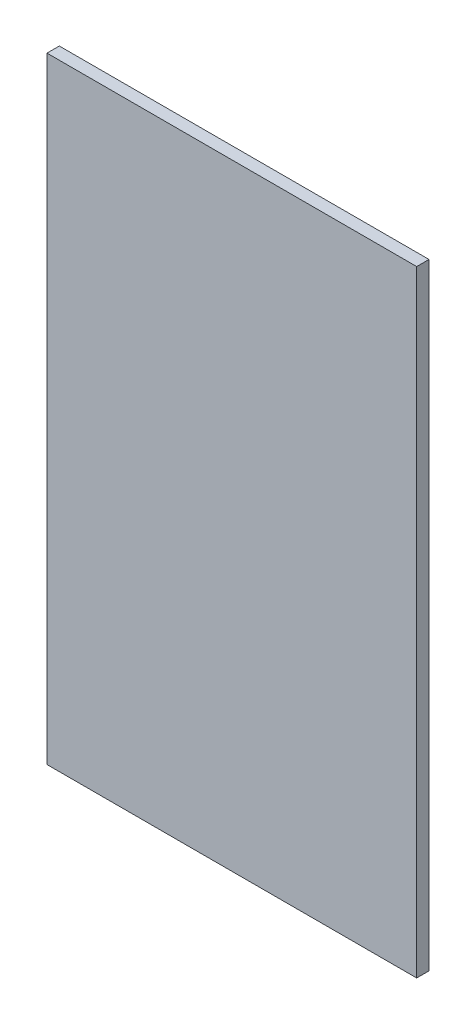
ISO-10303-21;
HEADER;
FILE_DESCRIPTION(('STEP AP214'),'2;1');
FILE_NAME('part.step','',(''),(''),'','','');
FILE_SCHEMA(('AUTOMOTIVE_DESIGN { 1 0 10303 214 1 1 1 1 }'));
ENDSEC;
DATA;
#1=APPLICATION_CONTEXT('core data for automotive mechanical design processes');
#2=APPLICATION_PROTOCOL_DEFINITION('international standard','automotive_design',2000,#1);
#3=PRODUCT_CONTEXT('',#1,'mechanical');
#4=PRODUCT('Part','Part','',(#3));
#5=PRODUCT_RELATED_PRODUCT_CATEGORY('part','',(#4));
#6=PRODUCT_DEFINITION_FORMATION('','',#4);
#7=PRODUCT_DEFINITION_CONTEXT('part definition',#1,'design');
#8=PRODUCT_DEFINITION('design','',#6,#7);
#9=PRODUCT_DEFINITION_SHAPE('','',#8);
#10=(LENGTH_UNIT() NAMED_UNIT(*) SI_UNIT(.MILLI.,.METRE.));
#11=(NAMED_UNIT(*) PLANE_ANGLE_UNIT() SI_UNIT($,.RADIAN.));
#12=(NAMED_UNIT(*) SI_UNIT($,.STERADIAN.) SOLID_ANGLE_UNIT());
#13=UNCERTAINTY_MEASURE_WITH_UNIT(LENGTH_MEASURE(1.E-05),#10,'distance_accuracy_value','');
#14=(GEOMETRIC_REPRESENTATION_CONTEXT(3) GLOBAL_UNCERTAINTY_ASSIGNED_CONTEXT((#13)) GLOBAL_UNIT_ASSIGNED_CONTEXT((#10,
#11,#12)) REPRESENTATION_CONTEXT('',''));
#15=CARTESIAN_POINT('',(0.,0.,0.));
#16=DIRECTION('',(0.,0.,1.));
#17=DIRECTION('',(1.,0.,0.));
#18=AXIS2_PLACEMENT_3D('',#15,#16,#17);
#19=CARTESIAN_POINT('',(0.,0.,3.));
#20=DIRECTION('',(1.,0.,0.));
#21=DIRECTION('',(0.,0.,-1.));
#22=AXIS2_PLACEMENT_3D('',#19,#20,#21);
#23=PLANE('',#22);
#24=DIRECTION('',(0.,-1.,0.));
#25=VECTOR('',#24,1.);
#26=CARTESIAN_POINT('',(0.,0.,0.));
#27=LINE('',#26,#25);
#28=CARTESIAN_POINT('',(0.,150.,0.));
#29=VERTEX_POINT('',#28);
#30=CARTESIAN_POINT('',(0.,0.,0.));
#31=VERTEX_POINT('',#30);
#32=EDGE_CURVE('E111',#29,#31,#27,.T.);
#33=ORIENTED_EDGE('',*,*,#32,.T.);
#34=DIRECTION('',(0.,0.,-1.));
#35=VECTOR('',#34,1.);
#36=CARTESIAN_POINT('',(0.,0.,3.));
#37=LINE('',#36,#35);
#38=CARTESIAN_POINT('',(0.,0.,3.));
#39=VERTEX_POINT('',#38);
#40=EDGE_CURVE('E11',#39,#31,#37,.T.);
#41=ORIENTED_EDGE('',*,*,#40,.F.);
#42=DIRECTION('',(0.,-1.,0.));
#43=VECTOR('',#42,1.);
#44=CARTESIAN_POINT('',(0.,0.,3.));
#45=LINE('',#44,#43);
#46=CARTESIAN_POINT('',(0.,150.,3.));
#47=VERTEX_POINT('',#46);
#48=EDGE_CURVE('E95',#47,#39,#45,.T.);
#49=ORIENTED_EDGE('',*,*,#48,.F.);
#50=DIRECTION('',(0.,0.,-1.));
#51=VECTOR('',#50,1.);
#52=CARTESIAN_POINT('',(0.,150.,3.));
#53=LINE('',#52,#51);
#54=EDGE_CURVE('E107',#47,#29,#53,.T.);
#55=ORIENTED_EDGE('',*,*,#54,.T.);
#56=EDGE_LOOP('',(#33,#41,#49,#55));
#57=FACE_BOUND('',#56,.T.);
#58=ADVANCED_FACE('F43',(#57),#23,.F.);
#59=CARTESIAN_POINT('',(0.,0.,3.));
#60=DIRECTION('',(0.,1.,0.));
#61=DIRECTION('',(0.,0.,1.));
#62=AXIS2_PLACEMENT_3D('',#59,#60,#61);
#63=PLANE('',#62);
#64=DIRECTION('',(1.,0.,0.));
#65=VECTOR('',#64,1.);
#66=CARTESIAN_POINT('',(0.,0.,0.));
#67=LINE('',#66,#65);
#68=CARTESIAN_POINT('',(90.,0.,0.));
#69=VERTEX_POINT('',#68);
#70=EDGE_CURVE('E100',#31,#69,#67,.T.);
#71=ORIENTED_EDGE('',*,*,#70,.T.);
#72=DIRECTION('',(0.,0.,-1.));
#73=VECTOR('',#72,1.);
#74=CARTESIAN_POINT('',(90.,0.,3.));
#75=LINE('',#74,#73);
#76=CARTESIAN_POINT('',(90.,0.,3.));
#77=VERTEX_POINT('',#76);
#78=EDGE_CURVE('E52',#77,#69,#75,.T.);
#79=ORIENTED_EDGE('',*,*,#78,.F.);
#80=DIRECTION('',(1.,0.,0.));
#81=VECTOR('',#80,1.);
#82=CARTESIAN_POINT('',(0.,0.,3.));
#83=LINE('',#82,#81);
#84=EDGE_CURVE('E90',#39,#77,#83,.T.);
#85=ORIENTED_EDGE('',*,*,#84,.F.);
#86=ORIENTED_EDGE('',*,*,#40,.T.);
#87=EDGE_LOOP('',(#71,#79,#85,#86));
#88=FACE_BOUND('',#87,.T.);
#89=ADVANCED_FACE('F99',(#88),#63,.F.);
#90=CARTESIAN_POINT('',(90.,0.,3.));
#91=DIRECTION('',(-1.,0.,0.));
#92=DIRECTION('',(0.,0.,1.));
#93=AXIS2_PLACEMENT_3D('',#90,#91,#92);
#94=PLANE('',#93);
#95=DIRECTION('',(0.,1.,0.));
#96=VECTOR('',#95,1.);
#97=CARTESIAN_POINT('',(90.,0.,0.));
#98=LINE('',#97,#96);
#99=CARTESIAN_POINT('',(90.,150.,0.));
#100=VERTEX_POINT('',#99);
#101=EDGE_CURVE('E77',#69,#100,#98,.T.);
#102=ORIENTED_EDGE('',*,*,#101,.T.);
#103=DIRECTION('',(0.,0.,-1.));
#104=VECTOR('',#103,1.);
#105=CARTESIAN_POINT('',(90.,150.,3.));
#106=LINE('',#105,#104);
#107=CARTESIAN_POINT('',(90.,150.,3.));
#108=VERTEX_POINT('',#107);
#109=EDGE_CURVE('E102',#108,#100,#106,.T.);
#110=ORIENTED_EDGE('',*,*,#109,.F.);
#111=DIRECTION('',(0.,1.,0.));
#112=VECTOR('',#111,1.);
#113=CARTESIAN_POINT('',(90.,0.,3.));
#114=LINE('',#113,#112);
#115=EDGE_CURVE('E93',#77,#108,#114,.T.);
#116=ORIENTED_EDGE('',*,*,#115,.F.);
#117=ORIENTED_EDGE('',*,*,#78,.T.);
#118=EDGE_LOOP('',(#102,#110,#116,#117));
#119=FACE_BOUND('',#118,.T.);
#120=ADVANCED_FACE('F103',(#119),#94,.F.);
#121=CARTESIAN_POINT('',(0.,150.,3.));
#122=DIRECTION('',(0.,-1.,0.));
#123=DIRECTION('',(0.,0.,-1.));
#124=AXIS2_PLACEMENT_3D('',#121,#122,#123);
#125=PLANE('',#124);
#126=DIRECTION('',(-1.,0.,0.));
#127=VECTOR('',#126,1.);
#128=CARTESIAN_POINT('',(0.,150.,0.));
#129=LINE('',#128,#127);
#130=EDGE_CURVE('E83',#100,#29,#129,.T.);
#131=ORIENTED_EDGE('',*,*,#130,.T.);
#132=ORIENTED_EDGE('',*,*,#54,.F.);
#133=DIRECTION('',(-1.,0.,0.));
#134=VECTOR('',#133,1.);
#135=CARTESIAN_POINT('',(0.,150.,3.));
#136=LINE('',#135,#134);
#137=EDGE_CURVE('E60',#108,#47,#136,.T.);
#138=ORIENTED_EDGE('',*,*,#137,.F.);
#139=ORIENTED_EDGE('',*,*,#109,.T.);
#140=EDGE_LOOP('',(#131,#132,#138,#139));
#141=FACE_BOUND('',#140,.T.);
#142=ADVANCED_FACE('F124',(#141),#125,.F.);
#143=CARTESIAN_POINT('',(0.,0.,3.));
#144=DIRECTION('',(0.,0.,-1.));
#145=DIRECTION('',(-1.,0.,0.));
#146=AXIS2_PLACEMENT_3D('',#143,#144,#145);
#147=PLANE('',#146);
#148=ORIENTED_EDGE('',*,*,#48,.T.);
#149=ORIENTED_EDGE('',*,*,#84,.T.);
#150=ORIENTED_EDGE('',*,*,#115,.T.);
#151=ORIENTED_EDGE('',*,*,#137,.T.);
#152=EDGE_LOOP('',(#148,#149,#150,#151));
#153=FACE_BOUND('',#152,.T.);
#154=ADVANCED_FACE('F91',(#153),#147,.F.);
#155=CARTESIAN_POINT('',(0.,0.,0.));
#156=DIRECTION('',(0.,0.,-1.));
#157=DIRECTION('',(-1.,0.,0.));
#158=AXIS2_PLACEMENT_3D('',#155,#156,#157);
#159=PLANE('',#158);
#160=ORIENTED_EDGE('',*,*,#32,.F.);
#161=ORIENTED_EDGE('',*,*,#130,.F.);
#162=ORIENTED_EDGE('',*,*,#101,.F.);
#163=ORIENTED_EDGE('',*,*,#70,.F.);
#164=EDGE_LOOP('',(#160,#161,#162,#163));
#165=FACE_BOUND('',#164,.T.);
#166=ADVANCED_FACE('F127',(#165),#159,.T.);
#167=CLOSED_SHELL('',(#58,#89,#120,#142,#154,#166));
#168=MANIFOLD_SOLID_BREP('B2',#167);
#169=ADVANCED_BREP_SHAPE_REPRESENTATION('',(#18,#168),#14);
#170=SHAPE_DEFINITION_REPRESENTATION(#9,#169);
ENDSEC;
END-ISO-10303-21;
